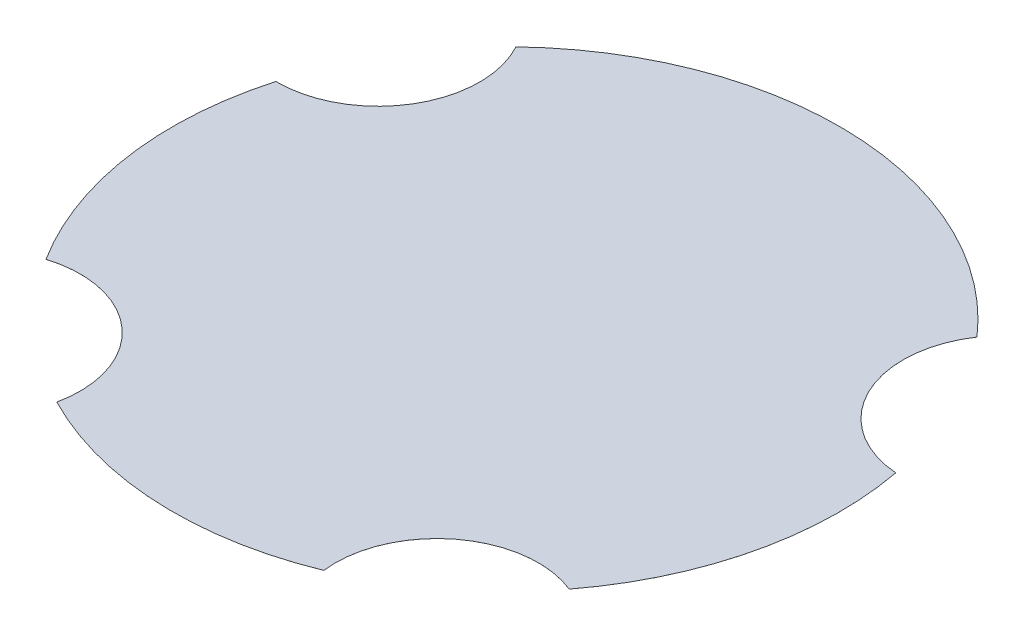
ISO-10303-21;
HEADER;
FILE_DESCRIPTION(('STEP AP214'),'2;1');
FILE_NAME('part.step','',(''),(''),'','','');
FILE_SCHEMA(('AUTOMOTIVE_DESIGN { 1 0 10303 214 1 1 1 1 }'));
ENDSEC;
DATA;
#1=APPLICATION_CONTEXT('core data for automotive mechanical design processes');
#2=APPLICATION_PROTOCOL_DEFINITION('international standard','automotive_design',2000,#1);
#3=PRODUCT_CONTEXT('',#1,'mechanical');
#4=PRODUCT('Part','Part','',(#3));
#5=PRODUCT_RELATED_PRODUCT_CATEGORY('part','',(#4));
#6=PRODUCT_DEFINITION_FORMATION('','',#4);
#7=PRODUCT_DEFINITION_CONTEXT('part definition',#1,'design');
#8=PRODUCT_DEFINITION('design','',#6,#7);
#9=PRODUCT_DEFINITION_SHAPE('','',#8);
#10=(LENGTH_UNIT() NAMED_UNIT(*) SI_UNIT(.MILLI.,.METRE.));
#11=(NAMED_UNIT(*) PLANE_ANGLE_UNIT() SI_UNIT($,.RADIAN.));
#12=(NAMED_UNIT(*) SI_UNIT($,.STERADIAN.) SOLID_ANGLE_UNIT());
#13=UNCERTAINTY_MEASURE_WITH_UNIT(LENGTH_MEASURE(1.E-05),#10,'distance_accuracy_value','');
#14=(GEOMETRIC_REPRESENTATION_CONTEXT(3) GLOBAL_UNCERTAINTY_ASSIGNED_CONTEXT((#13)) GLOBAL_UNIT_ASSIGNED_CONTEXT((#10,
#11,#12)) REPRESENTATION_CONTEXT('',''));
#15=CARTESIAN_POINT('',(0.,0.,0.));
#16=DIRECTION('',(0.,0.,1.));
#17=DIRECTION('',(1.,0.,0.));
#18=AXIS2_PLACEMENT_3D('',#15,#16,#17);
#19=CARTESIAN_POINT('',(-37.8405688592458,0.001,-15.5631016552417));
#20=DIRECTION('',(0.,-1.,0.));
#21=DIRECTION('',(0.,0.,-1.));
#22=AXIS2_PLACEMENT_3D('',#19,#20,#21);
#23=CYLINDRICAL_SURFACE('',#22,10.6500000000008);
#24=CARTESIAN_POINT('',(-37.8405688592458,0.,-15.5631016552417));
#25=DIRECTION('',(0.,1.,0.));
#26=DIRECTION('',(0.,0.,1.));
#27=AXIS2_PLACEMENT_3D('',#24,#25,#26);
#28=CIRCLE('',#27,10.6500000000008);
#29=CARTESIAN_POINT('',(-37.9376477909429,0.,-4.91354412072238));
#30=VERTEX_POINT('',#29);
#31=CARTESIAN_POINT('',(-28.4877273150347,0.,-20.6569072118855));
#32=VERTEX_POINT('',#31);
#33=EDGE_CURVE('E129',#30,#32,#28,.T.);
#34=ORIENTED_EDGE('',*,*,#33,.F.);
#35=DIRECTION('',(0.,-1.,0.));
#36=VECTOR('',#35,1.);
#37=CARTESIAN_POINT('',(-37.9376477909429,0.001,-4.91354412072238));
#38=LINE('',#37,#36);
#39=CARTESIAN_POINT('',(-37.9376477909429,0.001,-4.91354412072238));
#40=VERTEX_POINT('',#39);
#41=EDGE_CURVE('E11',#40,#30,#38,.T.);
#42=ORIENTED_EDGE('',*,*,#41,.F.);
#43=CARTESIAN_POINT('',(-37.8405688592458,0.001,-15.5631016552417));
#44=DIRECTION('',(0.,1.,0.));
#45=DIRECTION('',(0.,0.,1.));
#46=AXIS2_PLACEMENT_3D('',#43,#44,#45);
#47=CIRCLE('',#46,10.6500000000008);
#48=CARTESIAN_POINT('',(-28.4877273150347,0.001,-20.6569072118855));
#49=VERTEX_POINT('',#48);
#50=EDGE_CURVE('E149',#40,#49,#47,.T.);
#51=ORIENTED_EDGE('',*,*,#50,.T.);
#52=DIRECTION('',(0.,-1.,0.));
#53=VECTOR('',#52,1.);
#54=CARTESIAN_POINT('',(-28.4877273150347,0.001,-20.6569072118855));
#55=LINE('',#54,#53);
#56=EDGE_CURVE('E86',#49,#32,#55,.T.);
#57=ORIENTED_EDGE('',*,*,#56,.T.);
#58=EDGE_LOOP('',(#34,#42,#51,#57));
#59=FACE_BOUND('',#58,.T.);
#60=ADVANCED_FACE('F36',(#59),#23,.F.);
#61=CARTESIAN_POINT('',(-4.25452960799852,0.001,4.5968475365019));
#62=DIRECTION('',(0.,-1.,0.));
#63=DIRECTION('',(0.,0.,-1.));
#64=AXIS2_PLACEMENT_3D('',#61,#62,#63);
#65=CYLINDRICAL_SURFACE('',#64,35.);
#66=CARTESIAN_POINT('',(-4.25452960799852,0.,4.5968475365019));
#67=DIRECTION('',(0.,1.,0.));
#68=DIRECTION('',(0.,0.,1.));
#69=AXIS2_PLACEMENT_3D('',#66,#67,#68);
#70=CIRCLE('',#69,35.);
#71=CARTESIAN_POINT('',(-33.8385683439702,0.,23.2993781692406));
#72=VERTEX_POINT('',#71);
#73=EDGE_CURVE('E132',#30,#72,#70,.T.);
#74=ORIENTED_EDGE('',*,*,#73,.T.);
#75=DIRECTION('',(0.,-1.,0.));
#76=VECTOR('',#75,1.);
#77=CARTESIAN_POINT('',(-33.8385683439702,0.001,23.2993781692406));
#78=LINE('',#77,#76);
#79=CARTESIAN_POINT('',(-33.8385683439702,0.001,23.2993781692406));
#80=VERTEX_POINT('',#79);
#81=EDGE_CURVE('E44',#80,#72,#78,.T.);
#82=ORIENTED_EDGE('',*,*,#81,.F.);
#83=CARTESIAN_POINT('',(-4.25452960799852,0.001,4.5968475365019));
#84=DIRECTION('',(0.,1.,0.));
#85=DIRECTION('',(0.,0.,1.));
#86=AXIS2_PLACEMENT_3D('',#83,#84,#85);
#87=CIRCLE('',#86,35.);
#88=EDGE_CURVE('E176',#40,#80,#87,.T.);
#89=ORIENTED_EDGE('',*,*,#88,.F.);
#90=ORIENTED_EDGE('',*,*,#41,.T.);
#91=EDGE_LOOP('',(#74,#82,#89,#90));
#92=FACE_BOUND('',#91,.T.);
#93=ADVANCED_FACE('F165',(#92),#65,.T.);
#94=CARTESIAN_POINT('',(-30.7149108040228,0.001,33.4809921657115));
#95=DIRECTION('',(0.,-1.,0.));
#96=DIRECTION('',(0.,0.,-1.));
#97=AXIS2_PLACEMENT_3D('',#94,#95,#96);
#98=CYLINDRICAL_SURFACE('',#97,10.6500000000002);
#99=CARTESIAN_POINT('',(-30.7149108040228,0.,33.4809921657115));
#100=DIRECTION('',(0.,1.,0.));
#101=DIRECTION('',(0.,0.,1.));
#102=AXIS2_PLACEMENT_3D('',#99,#100,#101);
#103=CIRCLE('',#102,10.6500000000002);
#104=CARTESIAN_POINT('',(-20.2992053642049,0.,35.7026087372538));
#105=VERTEX_POINT('',#104);
#106=EDGE_CURVE('E135',#105,#72,#103,.T.);
#107=ORIENTED_EDGE('',*,*,#106,.F.);
#108=DIRECTION('',(0.,-1.,0.));
#109=VECTOR('',#108,1.);
#110=CARTESIAN_POINT('',(-20.2992053642049,0.001,35.7026087372538));
#111=LINE('',#110,#109);
#112=CARTESIAN_POINT('',(-20.2992053642049,0.001,35.7026087372538));
#113=VERTEX_POINT('',#112);
#114=EDGE_CURVE('E155',#113,#105,#111,.T.);
#115=ORIENTED_EDGE('',*,*,#114,.F.);
#116=CARTESIAN_POINT('',(-30.7149108040228,0.001,33.4809921657115));
#117=DIRECTION('',(0.,1.,0.));
#118=DIRECTION('',(0.,0.,1.));
#119=AXIS2_PLACEMENT_3D('',#116,#117,#118);
#120=CIRCLE('',#119,10.6500000000002);
#121=EDGE_CURVE('E162',#113,#80,#120,.T.);
#122=ORIENTED_EDGE('',*,*,#121,.T.);
#123=ORIENTED_EDGE('',*,*,#81,.T.);
#124=EDGE_LOOP('',(#107,#115,#122,#123));
#125=FACE_BOUND('',#124,.T.);
#126=ADVANCED_FACE('F160',(#125),#98,.F.);
#127=CARTESIAN_POINT('',(-4.25452960799852,0.001,4.5968475365019));
#128=DIRECTION('',(0.,-1.,0.));
#129=DIRECTION('',(0.,0.,-1.));
#130=AXIS2_PLACEMENT_3D('',#127,#128,#129);
#131=CYLINDRICAL_SURFACE('',#130,35.);
#132=CARTESIAN_POINT('',(-4.25452960799852,0.,4.5968475365019));
#133=DIRECTION('',(0.,1.,0.));
#134=DIRECTION('',(0.,0.,1.));
#135=AXIS2_PLACEMENT_3D('',#132,#133,#134);
#136=CIRCLE('',#135,35.);
#137=CARTESIAN_POINT('',(9.00178687088713,0.,36.9892860586574));
#138=VERTEX_POINT('',#137);
#139=EDGE_CURVE('E138',#105,#138,#136,.T.);
#140=ORIENTED_EDGE('',*,*,#139,.T.);
#141=DIRECTION('',(0.,-1.,0.));
#142=VECTOR('',#141,1.);
#143=CARTESIAN_POINT('',(9.00178687088713,0.001,36.9892860586574));
#144=LINE('',#143,#142);
#145=CARTESIAN_POINT('',(9.00178687088713,0.001,36.9892860586574));
#146=VERTEX_POINT('',#145);
#147=EDGE_CURVE('E153',#146,#138,#144,.T.);
#148=ORIENTED_EDGE('',*,*,#147,.F.);
#149=CARTESIAN_POINT('',(-4.25452960799852,0.001,4.5968475365019));
#150=DIRECTION('',(0.,1.,0.));
#151=DIRECTION('',(0.,0.,1.));
#152=AXIS2_PLACEMENT_3D('',#149,#150,#151);
#153=CIRCLE('',#152,35.);
#154=EDGE_CURVE('E174',#113,#146,#153,.T.);
#155=ORIENTED_EDGE('',*,*,#154,.F.);
#156=ORIENTED_EDGE('',*,*,#114,.T.);
#157=EDGE_LOOP('',(#140,#148,#155,#156));
#158=FACE_BOUND('',#157,.T.);
#159=ADVANCED_FACE('F172',(#158),#131,.T.);
#160=CARTESIAN_POINT('',(19.5721379906124,0.001,35.6892179052163));
#161=DIRECTION('',(0.,-1.,0.));
#162=DIRECTION('',(0.,0.,-1.));
#163=AXIS2_PLACEMENT_3D('',#160,#161,#162);
#164=CYLINDRICAL_SURFACE('',#163,10.6499999999);
#165=CARTESIAN_POINT('',(19.5721379906124,0.,35.6892179052163));
#166=DIRECTION('',(0.,1.,0.));
#167=DIRECTION('',(0.,0.,1.));
#168=AXIS2_PLACEMENT_3D('',#165,#166,#167);
#169=CIRCLE('',#168,10.6499999999);
#170=CARTESIAN_POINT('',(23.5762495639252,0.,25.8206014618473));
#171=VERTEX_POINT('',#170);
#172=EDGE_CURVE('E141',#171,#138,#169,.T.);
#173=ORIENTED_EDGE('',*,*,#172,.F.);
#174=DIRECTION('',(0.,-1.,0.));
#175=VECTOR('',#174,1.);
#176=CARTESIAN_POINT('',(23.5762495639252,0.001,25.8206014618473));
#177=LINE('',#176,#175);
#178=CARTESIAN_POINT('',(23.5762495639252,0.001,25.8206014618473));
#179=VERTEX_POINT('',#178);
#180=EDGE_CURVE('E122',#179,#171,#177,.T.);
#181=ORIENTED_EDGE('',*,*,#180,.F.);
#182=CARTESIAN_POINT('',(19.5721379906124,0.001,35.6892179052163));
#183=DIRECTION('',(0.,1.,0.));
#184=DIRECTION('',(0.,0.,1.));
#185=AXIS2_PLACEMENT_3D('',#182,#183,#184);
#186=CIRCLE('',#185,10.6499999999);
#187=EDGE_CURVE('E111',#179,#146,#186,.T.);
#188=ORIENTED_EDGE('',*,*,#187,.T.);
#189=ORIENTED_EDGE('',*,*,#147,.T.);
#190=EDGE_LOOP('',(#173,#181,#188,#189));
#191=FACE_BOUND('',#190,.T.);
#192=ADVANCED_FACE('F181',(#191),#164,.F.);
#193=CARTESIAN_POINT('',(-4.25452960799852,0.001,4.5968475365019));
#194=DIRECTION('',(0.,-1.,0.));
#195=DIRECTION('',(0.,0.,-1.));
#196=AXIS2_PLACEMENT_3D('',#193,#194,#195);
#197=CYLINDRICAL_SURFACE('',#196,35.);
#198=CARTESIAN_POINT('',(-4.25452960799852,0.,4.5968475365019));
#199=DIRECTION('',(0.,1.,0.));
#200=DIRECTION('',(0.,0.,1.));
#201=AXIS2_PLACEMENT_3D('',#198,#199,#200);
#202=CIRCLE('',#201,35.);
#203=CARTESIAN_POINT('',(30.1414110505157,0.,-1.87766141908467));
#204=VERTEX_POINT('',#203);
#205=EDGE_CURVE('E118',#171,#204,#202,.T.);
#206=ORIENTED_EDGE('',*,*,#205,.T.);
#207=DIRECTION('',(0.,-1.,0.));
#208=VECTOR('',#207,1.);
#209=CARTESIAN_POINT('',(30.1414110505157,0.001,-1.87766141908467));
#210=LINE('',#209,#208);
#211=CARTESIAN_POINT('',(30.1414110505157,0.001,-1.87766141908467));
#212=VERTEX_POINT('',#211);
#213=EDGE_CURVE('E115',#212,#204,#210,.T.);
#214=ORIENTED_EDGE('',*,*,#213,.F.);
#215=CARTESIAN_POINT('',(-4.25452960799852,0.001,4.5968475365019));
#216=DIRECTION('',(0.,1.,0.));
#217=DIRECTION('',(0.,0.,1.));
#218=AXIS2_PLACEMENT_3D('',#215,#216,#217);
#219=CIRCLE('',#218,35.);
#220=EDGE_CURVE('E105',#179,#212,#219,.T.);
#221=ORIENTED_EDGE('',*,*,#220,.F.);
#222=ORIENTED_EDGE('',*,*,#180,.T.);
#223=EDGE_LOOP('',(#206,#214,#221,#222));
#224=FACE_BOUND('',#223,.T.);
#225=ADVANCED_FACE('F116',(#224),#197,.T.);
#226=CARTESIAN_POINT('',(30.9396787995671,0.001,-12.5297267833844));
#227=DIRECTION('',(0.,-1.,0.));
#228=DIRECTION('',(0.,0.,-1.));
#229=AXIS2_PLACEMENT_3D('',#226,#227,#228);
#230=CYLINDRICAL_SURFACE('',#229,10.681934652697);
#231=CARTESIAN_POINT('',(30.9396787995671,0.,-12.5297267833844));
#232=DIRECTION('',(0.,1.,0.));
#233=DIRECTION('',(0.,0.,1.));
#234=AXIS2_PLACEMENT_3D('',#231,#232,#233);
#235=CIRCLE('',#234,10.681934652697);
#236=CARTESIAN_POINT('',(22.0648501999035,0.,-18.4745686863354));
#237=VERTEX_POINT('',#236);
#238=EDGE_CURVE('E145',#237,#204,#235,.T.);
#239=ORIENTED_EDGE('',*,*,#238,.F.);
#240=DIRECTION('',(0.,-1.,0.));
#241=VECTOR('',#240,1.);
#242=CARTESIAN_POINT('',(22.0648501999035,0.001,-18.4745686863354));
#243=LINE('',#242,#241);
#244=CARTESIAN_POINT('',(22.0648501999035,0.001,-18.4745686863354));
#245=VERTEX_POINT('',#244);
#246=EDGE_CURVE('E79',#245,#237,#243,.T.);
#247=ORIENTED_EDGE('',*,*,#246,.F.);
#248=CARTESIAN_POINT('',(30.9396787995671,0.001,-12.5297267833844));
#249=DIRECTION('',(0.,1.,0.));
#250=DIRECTION('',(0.,0.,1.));
#251=AXIS2_PLACEMENT_3D('',#248,#249,#250);
#252=CIRCLE('',#251,10.681934652697);
#253=EDGE_CURVE('E109',#245,#212,#252,.T.);
#254=ORIENTED_EDGE('',*,*,#253,.T.);
#255=ORIENTED_EDGE('',*,*,#213,.T.);
#256=EDGE_LOOP('',(#239,#247,#254,#255));
#257=FACE_BOUND('',#256,.T.);
#258=ADVANCED_FACE('F124',(#257),#230,.F.);
#259=CARTESIAN_POINT('',(-4.25452960799852,0.001,4.5968475365019));
#260=DIRECTION('',(0.,-1.,0.));
#261=DIRECTION('',(0.,0.,-1.));
#262=AXIS2_PLACEMENT_3D('',#259,#260,#261);
#263=CYLINDRICAL_SURFACE('',#262,35.);
#264=CARTESIAN_POINT('',(-4.25452960799852,0.,4.5968475365019));
#265=DIRECTION('',(0.,1.,0.));
#266=DIRECTION('',(0.,0.,1.));
#267=AXIS2_PLACEMENT_3D('',#264,#265,#266);
#268=CIRCLE('',#267,35.);
#269=EDGE_CURVE('E147',#237,#32,#268,.T.);
#270=ORIENTED_EDGE('',*,*,#269,.T.);
#271=ORIENTED_EDGE('',*,*,#56,.F.);
#272=CARTESIAN_POINT('',(-4.25452960799852,0.001,4.5968475365019));
#273=DIRECTION('',(0.,1.,0.));
#274=DIRECTION('',(0.,0.,1.));
#275=AXIS2_PLACEMENT_3D('',#272,#273,#274);
#276=CIRCLE('',#275,35.);
#277=EDGE_CURVE('E52',#245,#49,#276,.T.);
#278=ORIENTED_EDGE('',*,*,#277,.F.);
#279=ORIENTED_EDGE('',*,*,#246,.T.);
#280=EDGE_LOOP('',(#270,#271,#278,#279));
#281=FACE_BOUND('',#280,.T.);
#282=ADVANCED_FACE('F182',(#281),#263,.T.);
#283=CARTESIAN_POINT('',(-80.0166637454026,0.001,4.59684753650191));
#284=DIRECTION('',(0.,1.,0.));
#285=DIRECTION('',(0.,0.,1.));
#286=AXIS2_PLACEMENT_3D('',#283,#284,#285);
#287=PLANE('',#286);
#288=ORIENTED_EDGE('',*,*,#50,.F.);
#289=ORIENTED_EDGE('',*,*,#88,.T.);
#290=ORIENTED_EDGE('',*,*,#121,.F.);
#291=ORIENTED_EDGE('',*,*,#154,.T.);
#292=ORIENTED_EDGE('',*,*,#187,.F.);
#293=ORIENTED_EDGE('',*,*,#220,.T.);
#294=ORIENTED_EDGE('',*,*,#253,.F.);
#295=ORIENTED_EDGE('',*,*,#277,.T.);
#296=EDGE_LOOP('',(#288,#289,#290,#291,#292,#293,#294,#295));
#297=FACE_BOUND('',#296,.T.);
#298=ADVANCED_FACE('F107',(#297),#287,.T.);
#299=CARTESIAN_POINT('',(-80.0166637454026,0.,4.59684753650191));
#300=DIRECTION('',(0.,1.,0.));
#301=DIRECTION('',(0.,0.,1.));
#302=AXIS2_PLACEMENT_3D('',#299,#300,#301);
#303=PLANE('',#302);
#304=ORIENTED_EDGE('',*,*,#33,.T.);
#305=ORIENTED_EDGE('',*,*,#269,.F.);
#306=ORIENTED_EDGE('',*,*,#238,.T.);
#307=ORIENTED_EDGE('',*,*,#205,.F.);
#308=ORIENTED_EDGE('',*,*,#172,.T.);
#309=ORIENTED_EDGE('',*,*,#139,.F.);
#310=ORIENTED_EDGE('',*,*,#106,.T.);
#311=ORIENTED_EDGE('',*,*,#73,.F.);
#312=EDGE_LOOP('',(#304,#305,#306,#307,#308,#309,#310,#311));
#313=FACE_BOUND('',#312,.T.);
#314=ADVANCED_FACE('F168',(#313),#303,.F.);
#315=CLOSED_SHELL('',(#60,#93,#126,#159,#192,#225,#258,#282,#298,#314));
#316=MANIFOLD_SOLID_BREP('B2',#315);
#317=ADVANCED_BREP_SHAPE_REPRESENTATION('',(#18,#316),#14);
#318=SHAPE_DEFINITION_REPRESENTATION(#9,#317);
ENDSEC;
END-ISO-10303-21;
